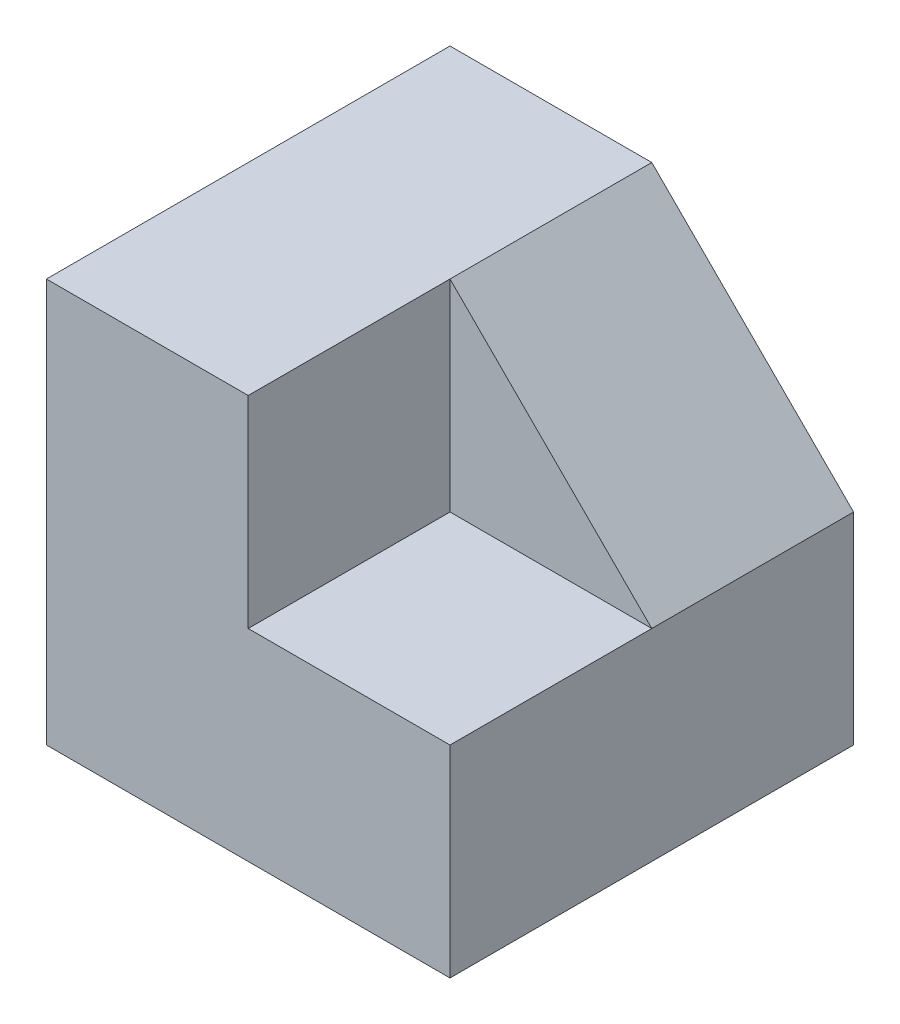
ISO-10303-21;
HEADER;
FILE_DESCRIPTION(('STEP AP214'),'2;1');
FILE_NAME('part.step','',(''),(''),'','','');
FILE_SCHEMA(('AUTOMOTIVE_DESIGN { 1 0 10303 214 1 1 1 1 }'));
ENDSEC;
DATA;
#1=APPLICATION_CONTEXT('core data for automotive mechanical design processes');
#2=APPLICATION_PROTOCOL_DEFINITION('international standard','automotive_design',2000,#1);
#3=PRODUCT_CONTEXT('',#1,'mechanical');
#4=PRODUCT('Part','Part','',(#3));
#5=PRODUCT_RELATED_PRODUCT_CATEGORY('part','',(#4));
#6=PRODUCT_DEFINITION_FORMATION('','',#4);
#7=PRODUCT_DEFINITION_CONTEXT('part definition',#1,'design');
#8=PRODUCT_DEFINITION('design','',#6,#7);
#9=PRODUCT_DEFINITION_SHAPE('','',#8);
#10=(LENGTH_UNIT() NAMED_UNIT(*) SI_UNIT(.MILLI.,.METRE.));
#11=(NAMED_UNIT(*) PLANE_ANGLE_UNIT() SI_UNIT($,.RADIAN.));
#12=(NAMED_UNIT(*) SI_UNIT($,.STERADIAN.) SOLID_ANGLE_UNIT());
#13=UNCERTAINTY_MEASURE_WITH_UNIT(LENGTH_MEASURE(1.E-05),#10,'distance_accuracy_value','');
#14=(GEOMETRIC_REPRESENTATION_CONTEXT(3) GLOBAL_UNCERTAINTY_ASSIGNED_CONTEXT((#13)) GLOBAL_UNIT_ASSIGNED_CONTEXT((#10,
#11,#12)) REPRESENTATION_CONTEXT('',''));
#15=CARTESIAN_POINT('',(0.,0.,0.));
#16=DIRECTION('',(0.,0.,1.));
#17=DIRECTION('',(1.,0.,0.));
#18=AXIS2_PLACEMENT_3D('',#15,#16,#17);
#19=CARTESIAN_POINT('',(0.,60.,-60.));
#20=DIRECTION('',(-1.,0.,0.));
#21=DIRECTION('',(0.,-1.,0.));
#22=AXIS2_PLACEMENT_3D('',#19,#20,#21);
#23=PLANE('',#22);
#24=DIRECTION('',(0.,-1.,0.));
#25=VECTOR('',#24,1.);
#26=CARTESIAN_POINT('',(0.,60.,0.));
#27=LINE('',#26,#25);
#28=CARTESIAN_POINT('',(0.,60.,0.));
#29=VERTEX_POINT('',#28);
#30=CARTESIAN_POINT('',(0.,0.,0.));
#31=VERTEX_POINT('',#30);
#32=EDGE_CURVE('E140',#29,#31,#27,.T.);
#33=ORIENTED_EDGE('',*,*,#32,.F.);
#34=DIRECTION('',(0.,0.,1.));
#35=VECTOR('',#34,1.);
#36=CARTESIAN_POINT('',(0.,60.,-60.));
#37=LINE('',#36,#35);
#38=CARTESIAN_POINT('',(0.,60.,-60.));
#39=VERTEX_POINT('',#38);
#40=EDGE_CURVE('E11',#39,#29,#37,.T.);
#41=ORIENTED_EDGE('',*,*,#40,.F.);
#42=DIRECTION('',(0.,-1.,0.));
#43=VECTOR('',#42,1.);
#44=CARTESIAN_POINT('',(0.,60.,-60.));
#45=LINE('',#44,#43);
#46=CARTESIAN_POINT('',(0.,0.,-60.));
#47=VERTEX_POINT('',#46);
#48=EDGE_CURVE('E130',#39,#47,#45,.T.);
#49=ORIENTED_EDGE('',*,*,#48,.T.);
#50=DIRECTION('',(0.,0.,1.));
#51=VECTOR('',#50,1.);
#52=CARTESIAN_POINT('',(0.,0.,-60.));
#53=LINE('',#52,#51);
#54=EDGE_CURVE('E42',#47,#31,#53,.T.);
#55=ORIENTED_EDGE('',*,*,#54,.T.);
#56=EDGE_LOOP('',(#33,#41,#49,#55));
#57=FACE_BOUND('',#56,.T.);
#58=ADVANCED_FACE('F39',(#57),#23,.T.);
#59=CARTESIAN_POINT('',(60.,60.,-60.));
#60=DIRECTION('',(0.,1.,0.));
#61=DIRECTION('',(-1.,0.,0.));
#62=AXIS2_PLACEMENT_3D('',#59,#60,#61);
#63=PLANE('',#62);
#64=DIRECTION('',(0.,0.,1.));
#65=VECTOR('',#64,1.);
#66=CARTESIAN_POINT('',(30.,60.,-60.));
#67=LINE('',#66,#65);
#68=CARTESIAN_POINT('',(30.,60.,-60.));
#69=VERTEX_POINT('',#68);
#70=CARTESIAN_POINT('',(30.,60.,-30.));
#71=VERTEX_POINT('',#70);
#72=EDGE_CURVE('E112',#69,#71,#67,.T.);
#73=ORIENTED_EDGE('',*,*,#72,.F.);
#74=DIRECTION('',(-1.,0.,0.));
#75=VECTOR('',#74,1.);
#76=CARTESIAN_POINT('',(60.,60.,-60.));
#77=LINE('',#76,#75);
#78=EDGE_CURVE('E64',#69,#39,#77,.T.);
#79=ORIENTED_EDGE('',*,*,#78,.T.);
#80=ORIENTED_EDGE('',*,*,#40,.T.);
#81=DIRECTION('',(-1.,0.,0.));
#82=VECTOR('',#81,1.);
#83=CARTESIAN_POINT('',(60.,60.,0.));
#84=LINE('',#83,#82);
#85=CARTESIAN_POINT('',(30.,60.,0.));
#86=VERTEX_POINT('',#85);
#87=EDGE_CURVE('E83',#86,#29,#84,.T.);
#88=ORIENTED_EDGE('',*,*,#87,.F.);
#89=DIRECTION('',(0.,0.,1.));
#90=VECTOR('',#89,1.);
#91=CARTESIAN_POINT('',(30.,60.,0.));
#92=LINE('',#91,#90);
#93=EDGE_CURVE('E124',#71,#86,#92,.T.);
#94=ORIENTED_EDGE('',*,*,#93,.F.);
#95=EDGE_LOOP('',(#73,#79,#80,#88,#94));
#96=FACE_BOUND('',#95,.T.);
#97=ADVANCED_FACE('F123',(#96),#63,.T.);
#98=CARTESIAN_POINT('',(60.,0.,-60.));
#99=DIRECTION('',(1.,0.,0.));
#100=DIRECTION('',(0.,0.,-1.));
#101=AXIS2_PLACEMENT_3D('',#98,#99,#100);
#102=PLANE('',#101);
#103=DIRECTION('',(0.,0.,1.));
#104=VECTOR('',#103,1.);
#105=CARTESIAN_POINT('',(60.,30.,-60.));
#106=LINE('',#105,#104);
#107=CARTESIAN_POINT('',(60.,30.,-60.));
#108=VERTEX_POINT('',#107);
#109=CARTESIAN_POINT('',(60.,30.,-30.));
#110=VERTEX_POINT('',#109);
#111=EDGE_CURVE('E115',#108,#110,#106,.T.);
#112=ORIENTED_EDGE('',*,*,#111,.T.);
#113=DIRECTION('',(0.,0.,-1.));
#114=VECTOR('',#113,1.);
#115=CARTESIAN_POINT('',(60.,30.,-30.));
#116=LINE('',#115,#114);
#117=CARTESIAN_POINT('',(60.,30.,0.));
#118=VERTEX_POINT('',#117);
#119=EDGE_CURVE('E160',#118,#110,#116,.T.);
#120=ORIENTED_EDGE('',*,*,#119,.F.);
#121=DIRECTION('',(0.,1.,0.));
#122=VECTOR('',#121,1.);
#123=CARTESIAN_POINT('',(60.,0.,0.));
#124=LINE('',#123,#122);
#125=CARTESIAN_POINT('',(60.,0.,0.));
#126=VERTEX_POINT('',#125);
#127=EDGE_CURVE('E148',#126,#118,#124,.T.);
#128=ORIENTED_EDGE('',*,*,#127,.F.);
#129=DIRECTION('',(0.,0.,1.));
#130=VECTOR('',#129,1.);
#131=CARTESIAN_POINT('',(60.,0.,-60.));
#132=LINE('',#131,#130);
#133=CARTESIAN_POINT('',(60.,0.,-60.));
#134=VERTEX_POINT('',#133);
#135=EDGE_CURVE('E48',#134,#126,#132,.T.);
#136=ORIENTED_EDGE('',*,*,#135,.F.);
#137=DIRECTION('',(0.,1.,0.));
#138=VECTOR('',#137,1.);
#139=CARTESIAN_POINT('',(60.,0.,-60.));
#140=LINE('',#139,#138);
#141=EDGE_CURVE('E132',#134,#108,#140,.T.);
#142=ORIENTED_EDGE('',*,*,#141,.T.);
#143=EDGE_LOOP('',(#112,#120,#128,#136,#142));
#144=FACE_BOUND('',#143,.T.);
#145=ADVANCED_FACE('F158',(#144),#102,.T.);
#146=CARTESIAN_POINT('',(0.,0.,-60.));
#147=DIRECTION('',(0.,-1.,0.));
#148=DIRECTION('',(0.,0.,-1.));
#149=AXIS2_PLACEMENT_3D('',#146,#147,#148);
#150=PLANE('',#149);
#151=DIRECTION('',(1.,0.,0.));
#152=VECTOR('',#151,1.);
#153=CARTESIAN_POINT('',(0.,0.,0.));
#154=LINE('',#153,#152);
#155=EDGE_CURVE('E143',#31,#126,#154,.T.);
#156=ORIENTED_EDGE('',*,*,#155,.F.);
#157=ORIENTED_EDGE('',*,*,#54,.F.);
#158=DIRECTION('',(1.,0.,0.));
#159=VECTOR('',#158,1.);
#160=CARTESIAN_POINT('',(0.,0.,-60.));
#161=LINE('',#160,#159);
#162=EDGE_CURVE('E136',#47,#134,#161,.T.);
#163=ORIENTED_EDGE('',*,*,#162,.T.);
#164=ORIENTED_EDGE('',*,*,#135,.T.);
#165=EDGE_LOOP('',(#156,#157,#163,#164));
#166=FACE_BOUND('',#165,.T.);
#167=ADVANCED_FACE('F155',(#166),#150,.T.);
#168=CARTESIAN_POINT('',(0.,0.,-60.));
#169=DIRECTION('',(0.,0.,1.));
#170=DIRECTION('',(1.,0.,0.));
#171=AXIS2_PLACEMENT_3D('',#168,#169,#170);
#172=PLANE('',#171);
#173=ORIENTED_EDGE('',*,*,#78,.F.);
#174=DIRECTION('',(0.707106781186547,-0.707106781186547,0.));
#175=VECTOR('',#174,1.);
#176=CARTESIAN_POINT('',(60.,30.,-60.));
#177=LINE('',#176,#175);
#178=EDGE_CURVE('E110',#69,#108,#177,.T.);
#179=ORIENTED_EDGE('',*,*,#178,.T.);
#180=ORIENTED_EDGE('',*,*,#141,.F.);
#181=ORIENTED_EDGE('',*,*,#162,.F.);
#182=ORIENTED_EDGE('',*,*,#48,.F.);
#183=EDGE_LOOP('',(#173,#179,#180,#181,#182));
#184=FACE_BOUND('',#183,.T.);
#185=ADVANCED_FACE('F128',(#184),#172,.F.);
#186=CARTESIAN_POINT('',(0.,0.,0.));
#187=DIRECTION('',(0.,0.,1.));
#188=DIRECTION('',(1.,0.,0.));
#189=AXIS2_PLACEMENT_3D('',#186,#187,#188);
#190=PLANE('',#189);
#191=DIRECTION('',(0.,1.,0.));
#192=VECTOR('',#191,1.);
#193=CARTESIAN_POINT('',(30.,30.,0.));
#194=LINE('',#193,#192);
#195=CARTESIAN_POINT('',(30.,30.,0.));
#196=VERTEX_POINT('',#195);
#197=EDGE_CURVE('E144',#196,#86,#194,.T.);
#198=ORIENTED_EDGE('',*,*,#197,.T.);
#199=ORIENTED_EDGE('',*,*,#87,.T.);
#200=ORIENTED_EDGE('',*,*,#32,.T.);
#201=ORIENTED_EDGE('',*,*,#155,.T.);
#202=ORIENTED_EDGE('',*,*,#127,.T.);
#203=DIRECTION('',(1.,0.,0.));
#204=VECTOR('',#203,1.);
#205=CARTESIAN_POINT('',(60.,30.,0.));
#206=LINE('',#205,#204);
#207=EDGE_CURVE('E177',#196,#118,#206,.T.);
#208=ORIENTED_EDGE('',*,*,#207,.F.);
#209=EDGE_LOOP('',(#198,#199,#200,#201,#202,#208));
#210=FACE_BOUND('',#209,.T.);
#211=ADVANCED_FACE('F162',(#210),#190,.T.);
#212=CARTESIAN_POINT('',(30.,30.,0.));
#213=DIRECTION('',(-1.,0.,0.));
#214=DIRECTION('',(0.,-1.,0.));
#215=AXIS2_PLACEMENT_3D('',#212,#213,#214);
#216=PLANE('',#215);
#217=ORIENTED_EDGE('',*,*,#93,.T.);
#218=ORIENTED_EDGE('',*,*,#197,.F.);
#219=DIRECTION('',(0.,0.,1.));
#220=VECTOR('',#219,1.);
#221=CARTESIAN_POINT('',(30.,30.,0.));
#222=LINE('',#221,#220);
#223=CARTESIAN_POINT('',(30.,30.,-30.));
#224=VERTEX_POINT('',#223);
#225=EDGE_CURVE('E56',#224,#196,#222,.T.);
#226=ORIENTED_EDGE('',*,*,#225,.F.);
#227=DIRECTION('',(0.,1.,0.));
#228=VECTOR('',#227,1.);
#229=CARTESIAN_POINT('',(30.,30.,-30.));
#230=LINE('',#229,#228);
#231=EDGE_CURVE('E169',#224,#71,#230,.T.);
#232=ORIENTED_EDGE('',*,*,#231,.T.);
#233=EDGE_LOOP('',(#217,#218,#226,#232));
#234=FACE_BOUND('',#233,.T.);
#235=ADVANCED_FACE('F195',(#234),#216,.F.);
#236=CARTESIAN_POINT('',(30.,30.,-30.));
#237=DIRECTION('',(0.,0.,-1.));
#238=DIRECTION('',(-1.,0.,0.));
#239=AXIS2_PLACEMENT_3D('',#236,#237,#238);
#240=PLANE('',#239);
#241=DIRECTION('',(-1.,0.,0.));
#242=VECTOR('',#241,1.);
#243=CARTESIAN_POINT('',(30.,30.,-30.));
#244=LINE('',#243,#242);
#245=EDGE_CURVE('E180',#110,#224,#244,.T.);
#246=ORIENTED_EDGE('',*,*,#245,.F.);
#247=DIRECTION('',(0.707106781186547,-0.707106781186547,0.));
#248=VECTOR('',#247,1.);
#249=CARTESIAN_POINT('',(60.,30.,-30.));
#250=LINE('',#249,#248);
#251=EDGE_CURVE('E120',#71,#110,#250,.T.);
#252=ORIENTED_EDGE('',*,*,#251,.F.);
#253=ORIENTED_EDGE('',*,*,#231,.F.);
#254=EDGE_LOOP('',(#246,#252,#253));
#255=FACE_BOUND('',#254,.T.);
#256=ADVANCED_FACE('F192',(#255),#240,.F.);
#257=CARTESIAN_POINT('',(0.,30.,0.));
#258=DIRECTION('',(0.,-1.,0.));
#259=DIRECTION('',(0.,0.,-1.));
#260=AXIS2_PLACEMENT_3D('',#257,#258,#259);
#261=PLANE('',#260);
#262=ORIENTED_EDGE('',*,*,#207,.T.);
#263=ORIENTED_EDGE('',*,*,#119,.T.);
#264=ORIENTED_EDGE('',*,*,#245,.T.);
#265=ORIENTED_EDGE('',*,*,#225,.T.);
#266=EDGE_LOOP('',(#262,#263,#264,#265));
#267=FACE_BOUND('',#266,.T.);
#268=ADVANCED_FACE('F193',(#267),#261,.F.);
#269=CARTESIAN_POINT('',(60.,30.,-60.));
#270=DIRECTION('',(-0.707106781186547,-0.707106781186547,0.));
#271=DIRECTION('',(0.707106781186548,-0.707106781186548,0.));
#272=AXIS2_PLACEMENT_3D('',#269,#270,#271);
#273=PLANE('',#272);
#274=ORIENTED_EDGE('',*,*,#251,.T.);
#275=ORIENTED_EDGE('',*,*,#111,.F.);
#276=ORIENTED_EDGE('',*,*,#178,.F.);
#277=ORIENTED_EDGE('',*,*,#72,.T.);
#278=EDGE_LOOP('',(#274,#275,#276,#277));
#279=FACE_BOUND('',#278,.T.);
#280=ADVANCED_FACE('F111',(#279),#273,.F.);
#281=CLOSED_SHELL('',(#58,#97,#145,#167,#185,#211,#235,#256,#268,#280));
#282=MANIFOLD_SOLID_BREP('B2',#281);
#283=ADVANCED_BREP_SHAPE_REPRESENTATION('',(#18,#282),#14);
#284=SHAPE_DEFINITION_REPRESENTATION(#9,#283);
ENDSEC;
END-ISO-10303-21;
